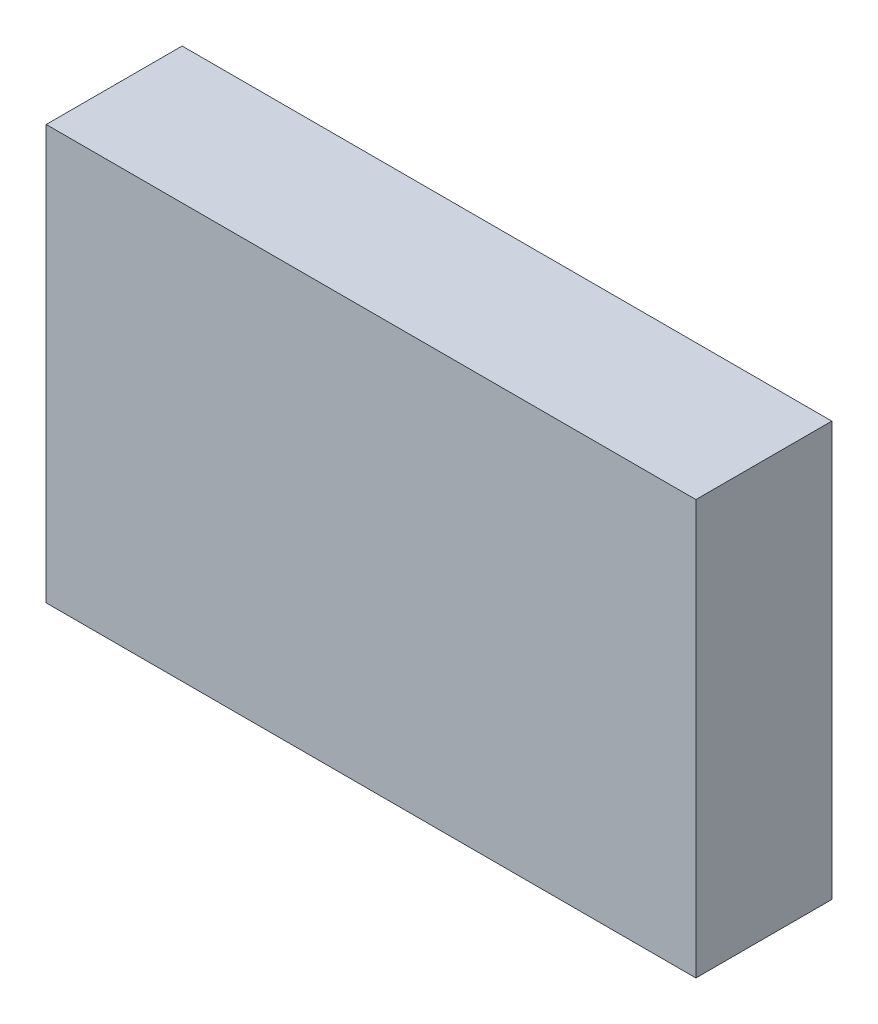
ISO-10303-21;
HEADER;
FILE_DESCRIPTION(('STEP AP214'),'2;1');
FILE_NAME('part.step','',(''),(''),'','','');
FILE_SCHEMA(('AUTOMOTIVE_DESIGN { 1 0 10303 214 1 1 1 1 }'));
ENDSEC;
DATA;
#1=APPLICATION_CONTEXT('core data for automotive mechanical design processes');
#2=APPLICATION_PROTOCOL_DEFINITION('international standard','automotive_design',2000,#1);
#3=PRODUCT_CONTEXT('',#1,'mechanical');
#4=PRODUCT('Part','Part','',(#3));
#5=PRODUCT_RELATED_PRODUCT_CATEGORY('part','',(#4));
#6=PRODUCT_DEFINITION_FORMATION('','',#4);
#7=PRODUCT_DEFINITION_CONTEXT('part definition',#1,'design');
#8=PRODUCT_DEFINITION('design','',#6,#7);
#9=PRODUCT_DEFINITION_SHAPE('','',#8);
#10=(LENGTH_UNIT() NAMED_UNIT(*) SI_UNIT(.MILLI.,.METRE.));
#11=(NAMED_UNIT(*) PLANE_ANGLE_UNIT() SI_UNIT($,.RADIAN.));
#12=(NAMED_UNIT(*) SI_UNIT($,.STERADIAN.) SOLID_ANGLE_UNIT());
#13=UNCERTAINTY_MEASURE_WITH_UNIT(LENGTH_MEASURE(1.E-05),#10,'distance_accuracy_value','');
#14=(GEOMETRIC_REPRESENTATION_CONTEXT(3) GLOBAL_UNCERTAINTY_ASSIGNED_CONTEXT((#13)) GLOBAL_UNIT_ASSIGNED_CONTEXT((#10,
#11,#12)) REPRESENTATION_CONTEXT('',''));
#15=CARTESIAN_POINT('',(0.,0.,0.));
#16=DIRECTION('',(0.,0.,1.));
#17=DIRECTION('',(1.,0.,0.));
#18=AXIS2_PLACEMENT_3D('',#15,#16,#17);
#19=CARTESIAN_POINT('',(-21.7668257623432,-15.2434195209508,0.41));
#20=DIRECTION('',(1.,0.,0.));
#21=DIRECTION('',(0.,1.,0.));
#22=AXIS2_PLACEMENT_3D('',#19,#20,#21);
#23=PLANE('',#22);
#24=DIRECTION('',(0.,-1.,0.));
#25=VECTOR('',#24,1.);
#26=CARTESIAN_POINT('',(-21.7668257623432,-15.2434195209508,0.));
#27=LINE('',#26,#25);
#28=CARTESIAN_POINT('',(-21.7668257623432,-15.2434195209508,0.));
#29=VERTEX_POINT('',#28);
#30=CARTESIAN_POINT('',(-21.7668257623432,-16.4934195209508,0.));
#31=VERTEX_POINT('',#30);
#32=EDGE_CURVE('E98',#29,#31,#27,.T.);
#33=ORIENTED_EDGE('',*,*,#32,.T.);
#34=DIRECTION('',(0.,0.,-1.));
#35=VECTOR('',#34,1.);
#36=CARTESIAN_POINT('',(-21.7668257623432,-16.4934195209508,0.41));
#37=LINE('',#36,#35);
#38=CARTESIAN_POINT('',(-21.7668257623432,-16.4934195209508,0.41));
#39=VERTEX_POINT('',#38);
#40=EDGE_CURVE('E11',#39,#31,#37,.T.);
#41=ORIENTED_EDGE('',*,*,#40,.F.);
#42=DIRECTION('',(0.,-1.,0.));
#43=VECTOR('',#42,1.);
#44=CARTESIAN_POINT('',(-21.7668257623432,-15.2434195209508,0.41));
#45=LINE('',#44,#43);
#46=CARTESIAN_POINT('',(-21.7668257623432,-15.2434195209508,0.41));
#47=VERTEX_POINT('',#46);
#48=EDGE_CURVE('E86',#47,#39,#45,.T.);
#49=ORIENTED_EDGE('',*,*,#48,.F.);
#50=DIRECTION('',(0.,0.,-1.));
#51=VECTOR('',#50,1.);
#52=CARTESIAN_POINT('',(-21.7668257623432,-15.2434195209508,0.41));
#53=LINE('',#52,#51);
#54=EDGE_CURVE('E94',#47,#29,#53,.T.);
#55=ORIENTED_EDGE('',*,*,#54,.T.);
#56=EDGE_LOOP('',(#33,#41,#49,#55));
#57=FACE_BOUND('',#56,.T.);
#58=ADVANCED_FACE('F35',(#57),#23,.F.);
#59=CARTESIAN_POINT('',(-21.7668257623432,-16.4934195209508,0.41));
#60=DIRECTION('',(0.,1.,0.));
#61=DIRECTION('',(0.,0.,1.));
#62=AXIS2_PLACEMENT_3D('',#59,#60,#61);
#63=PLANE('',#62);
#64=DIRECTION('',(1.,0.,0.));
#65=VECTOR('',#64,1.);
#66=CARTESIAN_POINT('',(-21.7668257623432,-16.4934195209508,0.));
#67=LINE('',#66,#65);
#68=CARTESIAN_POINT('',(-19.8068257623432,-16.4934195209508,0.));
#69=VERTEX_POINT('',#68);
#70=EDGE_CURVE('E90',#31,#69,#67,.T.);
#71=ORIENTED_EDGE('',*,*,#70,.T.);
#72=DIRECTION('',(0.,0.,-1.));
#73=VECTOR('',#72,1.);
#74=CARTESIAN_POINT('',(-19.8068257623432,-16.4934195209508,0.41));
#75=LINE('',#74,#73);
#76=CARTESIAN_POINT('',(-19.8068257623432,-16.4934195209508,0.41));
#77=VERTEX_POINT('',#76);
#78=EDGE_CURVE('E43',#77,#69,#75,.T.);
#79=ORIENTED_EDGE('',*,*,#78,.F.);
#80=DIRECTION('',(1.,0.,0.));
#81=VECTOR('',#80,1.);
#82=CARTESIAN_POINT('',(-21.7668257623432,-16.4934195209508,0.41));
#83=LINE('',#82,#81);
#84=EDGE_CURVE('E81',#39,#77,#83,.T.);
#85=ORIENTED_EDGE('',*,*,#84,.F.);
#86=ORIENTED_EDGE('',*,*,#40,.T.);
#87=EDGE_LOOP('',(#71,#79,#85,#86));
#88=FACE_BOUND('',#87,.T.);
#89=ADVANCED_FACE('F89',(#88),#63,.F.);
#90=CARTESIAN_POINT('',(-19.8068257623432,-15.2434195209508,0.41));
#91=DIRECTION('',(-1.,0.,0.));
#92=DIRECTION('',(0.,-1.,0.));
#93=AXIS2_PLACEMENT_3D('',#90,#91,#92);
#94=PLANE('',#93);
#95=DIRECTION('',(0.,1.,0.));
#96=VECTOR('',#95,1.);
#97=CARTESIAN_POINT('',(-19.8068257623432,-15.2434195209508,0.));
#98=LINE('',#97,#96);
#99=CARTESIAN_POINT('',(-19.8068257623432,-15.2434195209508,0.));
#100=VERTEX_POINT('',#99);
#101=EDGE_CURVE('E68',#69,#100,#98,.T.);
#102=ORIENTED_EDGE('',*,*,#101,.T.);
#103=DIRECTION('',(0.,0.,-1.));
#104=VECTOR('',#103,1.);
#105=CARTESIAN_POINT('',(-19.8068257623432,-15.2434195209508,0.41));
#106=LINE('',#105,#104);
#107=CARTESIAN_POINT('',(-19.8068257623432,-15.2434195209508,0.41));
#108=VERTEX_POINT('',#107);
#109=EDGE_CURVE('E91',#108,#100,#106,.T.);
#110=ORIENTED_EDGE('',*,*,#109,.F.);
#111=DIRECTION('',(0.,1.,0.));
#112=VECTOR('',#111,1.);
#113=CARTESIAN_POINT('',(-19.8068257623432,-15.2434195209508,0.41));
#114=LINE('',#113,#112);
#115=EDGE_CURVE('E84',#77,#108,#114,.T.);
#116=ORIENTED_EDGE('',*,*,#115,.F.);
#117=ORIENTED_EDGE('',*,*,#78,.T.);
#118=EDGE_LOOP('',(#102,#110,#116,#117));
#119=FACE_BOUND('',#118,.T.);
#120=ADVANCED_FACE('F92',(#119),#94,.F.);
#121=CARTESIAN_POINT('',(-21.7668257623432,-15.2434195209508,0.41));
#122=DIRECTION('',(0.,-1.,0.));
#123=DIRECTION('',(0.,0.,-1.));
#124=AXIS2_PLACEMENT_3D('',#121,#122,#123);
#125=PLANE('',#124);
#126=DIRECTION('',(-1.,0.,0.));
#127=VECTOR('',#126,1.);
#128=CARTESIAN_POINT('',(-21.7668257623432,-15.2434195209508,0.));
#129=LINE('',#128,#127);
#130=EDGE_CURVE('E74',#100,#29,#129,.T.);
#131=ORIENTED_EDGE('',*,*,#130,.T.);
#132=ORIENTED_EDGE('',*,*,#54,.F.);
#133=DIRECTION('',(-1.,0.,0.));
#134=VECTOR('',#133,1.);
#135=CARTESIAN_POINT('',(-21.7668257623432,-15.2434195209508,0.41));
#136=LINE('',#135,#134);
#137=EDGE_CURVE('E51',#108,#47,#136,.T.);
#138=ORIENTED_EDGE('',*,*,#137,.F.);
#139=ORIENTED_EDGE('',*,*,#109,.T.);
#140=EDGE_LOOP('',(#131,#132,#138,#139));
#141=FACE_BOUND('',#140,.T.);
#142=ADVANCED_FACE('F105',(#141),#125,.F.);
#143=CARTESIAN_POINT('',(0.,0.,0.41));
#144=DIRECTION('',(0.,0.,1.));
#145=DIRECTION('',(1.,0.,0.));
#146=AXIS2_PLACEMENT_3D('',#143,#144,#145);
#147=PLANE('',#146);
#148=ORIENTED_EDGE('',*,*,#48,.T.);
#149=ORIENTED_EDGE('',*,*,#84,.T.);
#150=ORIENTED_EDGE('',*,*,#115,.T.);
#151=ORIENTED_EDGE('',*,*,#137,.T.);
#152=EDGE_LOOP('',(#148,#149,#150,#151));
#153=FACE_BOUND('',#152,.T.);
#154=ADVANCED_FACE('F82',(#153),#147,.T.);
#155=CARTESIAN_POINT('',(0.,0.,0.));
#156=DIRECTION('',(0.,0.,1.));
#157=DIRECTION('',(1.,0.,0.));
#158=AXIS2_PLACEMENT_3D('',#155,#156,#157);
#159=PLANE('',#158);
#160=ORIENTED_EDGE('',*,*,#32,.F.);
#161=ORIENTED_EDGE('',*,*,#130,.F.);
#162=ORIENTED_EDGE('',*,*,#101,.F.);
#163=ORIENTED_EDGE('',*,*,#70,.F.);
#164=EDGE_LOOP('',(#160,#161,#162,#163));
#165=FACE_BOUND('',#164,.T.);
#166=ADVANCED_FACE('F108',(#165),#159,.F.);
#167=CLOSED_SHELL('',(#58,#89,#120,#142,#154,#166));
#168=MANIFOLD_SOLID_BREP('B2',#167);
#169=ADVANCED_BREP_SHAPE_REPRESENTATION('',(#18,#168),#14);
#170=SHAPE_DEFINITION_REPRESENTATION(#9,#169);
ENDSEC;
END-ISO-10303-21;
